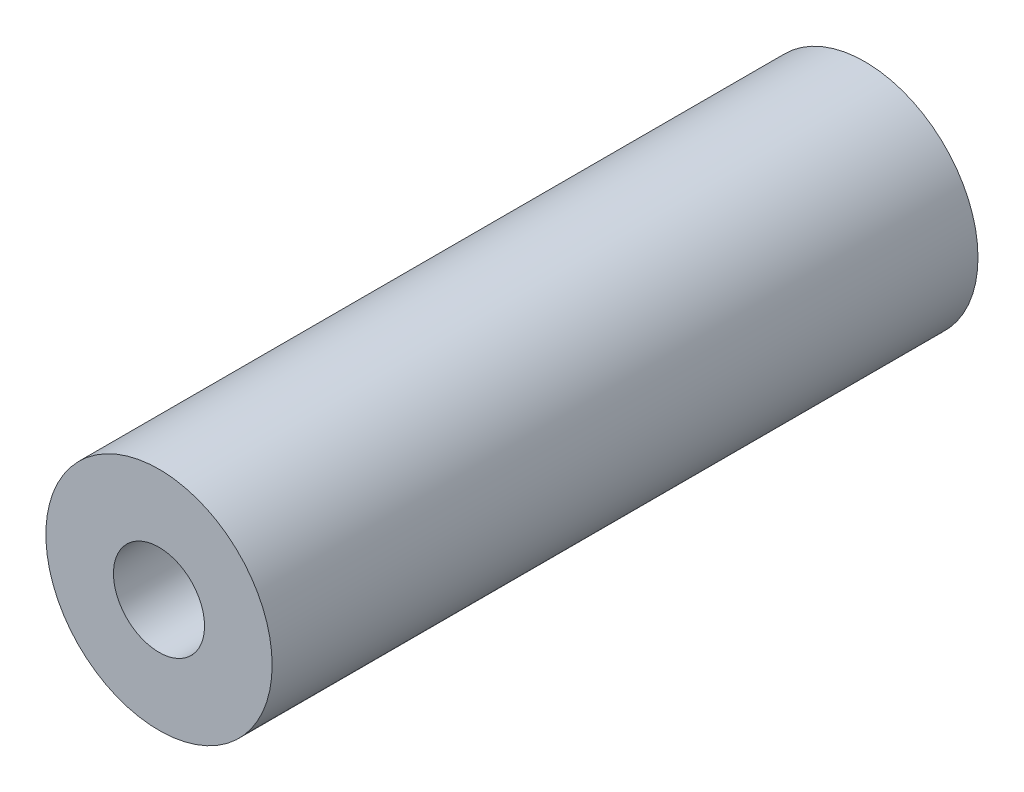
ISO-10303-21;
HEADER;
FILE_DESCRIPTION(('STEP AP214'),'2;1');
FILE_NAME('part.step','',(''),(''),'','','');
FILE_SCHEMA(('AUTOMOTIVE_DESIGN { 1 0 10303 214 1 1 1 1 }'));
ENDSEC;
DATA;
#1=APPLICATION_CONTEXT('core data for automotive mechanical design processes');
#2=APPLICATION_PROTOCOL_DEFINITION('international standard','automotive_design',2000,#1);
#3=PRODUCT_CONTEXT('',#1,'mechanical');
#4=PRODUCT('Part','Part','',(#3));
#5=PRODUCT_RELATED_PRODUCT_CATEGORY('part','',(#4));
#6=PRODUCT_DEFINITION_FORMATION('','',#4);
#7=PRODUCT_DEFINITION_CONTEXT('part definition',#1,'design');
#8=PRODUCT_DEFINITION('design','',#6,#7);
#9=PRODUCT_DEFINITION_SHAPE('','',#8);
#10=(LENGTH_UNIT() NAMED_UNIT(*) SI_UNIT(.MILLI.,.METRE.));
#11=(NAMED_UNIT(*) PLANE_ANGLE_UNIT() SI_UNIT($,.RADIAN.));
#12=(NAMED_UNIT(*) SI_UNIT($,.STERADIAN.) SOLID_ANGLE_UNIT());
#13=UNCERTAINTY_MEASURE_WITH_UNIT(LENGTH_MEASURE(1.E-05),#10,'distance_accuracy_value','');
#14=(GEOMETRIC_REPRESENTATION_CONTEXT(3) GLOBAL_UNCERTAINTY_ASSIGNED_CONTEXT((#13)) GLOBAL_UNIT_ASSIGNED_CONTEXT((#10,
#11,#12)) REPRESENTATION_CONTEXT('',''));
#15=CARTESIAN_POINT('',(0.,0.,0.));
#16=DIRECTION('',(0.,0.,1.));
#17=DIRECTION('',(1.,0.,0.));
#18=AXIS2_PLACEMENT_3D('',#15,#16,#17);
#19=CARTESIAN_POINT('',(0.,0.,196.85));
#20=DIRECTION('',(0.,0.,1.));
#21=DIRECTION('',(1.,0.,0.));
#22=AXIS2_PLACEMENT_3D('',#19,#20,#21);
#23=PLANE('',#22);
#24=CARTESIAN_POINT('',(0.,0.,196.85));
#25=DIRECTION('',(0.,0.,1.));
#26=DIRECTION('',(1.,0.,0.));
#27=AXIS2_PLACEMENT_3D('',#24,#25,#26);
#28=CIRCLE('',#27,31.55315);
#29=CARTESIAN_POINT('',(31.55315,0.,196.85));
#30=VERTEX_POINT('',#29);
#31=EDGE_CURVE('E10',#30,#30,#28,.T.);
#32=ORIENTED_EDGE('',*,*,#31,.T.);
#33=EDGE_LOOP('',(#32));
#34=FACE_BOUND('',#33,.T.);
#35=CARTESIAN_POINT('',(0.,0.,196.85));
#36=DIRECTION('',(0.,0.,1.));
#37=DIRECTION('',(1.,0.,0.));
#38=AXIS2_PLACEMENT_3D('',#35,#36,#37);
#39=CIRCLE('',#38,12.7);
#40=CARTESIAN_POINT('',(12.7,0.,196.85));
#41=VERTEX_POINT('',#40);
#42=EDGE_CURVE('E43',#41,#41,#39,.T.);
#43=ORIENTED_EDGE('',*,*,#42,.F.);
#44=EDGE_LOOP('',(#43));
#45=FACE_BOUND('',#44,.T.);
#46=ADVANCED_FACE('F32',(#34,#45),#23,.T.);
#47=CARTESIAN_POINT('',(0.,0.,0.));
#48=DIRECTION('',(0.,0.,1.));
#49=DIRECTION('',(1.,0.,0.));
#50=AXIS2_PLACEMENT_3D('',#47,#48,#49);
#51=PLANE('',#50);
#52=CARTESIAN_POINT('',(0.,0.,0.));
#53=DIRECTION('',(0.,0.,1.));
#54=DIRECTION('',(1.,0.,0.));
#55=AXIS2_PLACEMENT_3D('',#52,#53,#54);
#56=CIRCLE('',#55,31.55315);
#57=CARTESIAN_POINT('',(31.55315,0.,0.));
#58=VERTEX_POINT('',#57);
#59=EDGE_CURVE('E36',#58,#58,#56,.T.);
#60=ORIENTED_EDGE('',*,*,#59,.F.);
#61=EDGE_LOOP('',(#60));
#62=FACE_BOUND('',#61,.T.);
#63=CARTESIAN_POINT('',(0.,0.,0.));
#64=DIRECTION('',(0.,0.,1.));
#65=DIRECTION('',(1.,0.,0.));
#66=AXIS2_PLACEMENT_3D('',#63,#64,#65);
#67=CIRCLE('',#66,12.7);
#68=CARTESIAN_POINT('',(12.7,0.,0.));
#69=VERTEX_POINT('',#68);
#70=EDGE_CURVE('E45',#69,#69,#67,.T.);
#71=ORIENTED_EDGE('',*,*,#70,.T.);
#72=EDGE_LOOP('',(#71));
#73=FACE_BOUND('',#72,.T.);
#74=ADVANCED_FACE('F55',(#62,#73),#51,.F.);
#75=CARTESIAN_POINT('',(0.,0.,196.85));
#76=DIRECTION('',(0.,0.,-1.));
#77=DIRECTION('',(-1.,0.,0.));
#78=AXIS2_PLACEMENT_3D('',#75,#76,#77);
#79=CYLINDRICAL_SURFACE('',#78,31.55315);
#80=ORIENTED_EDGE('',*,*,#31,.F.);
#81=EDGE_LOOP('',(#80));
#82=FACE_BOUND('',#81,.T.);
#83=ORIENTED_EDGE('',*,*,#59,.T.);
#84=EDGE_LOOP('',(#83));
#85=FACE_BOUND('',#84,.T.);
#86=ADVANCED_FACE('F34',(#82,#85),#79,.T.);
#87=CARTESIAN_POINT('',(0.,0.,196.85));
#88=DIRECTION('',(0.,0.,-1.));
#89=DIRECTION('',(-1.,0.,0.));
#90=AXIS2_PLACEMENT_3D('',#87,#88,#89);
#91=CYLINDRICAL_SURFACE('',#90,12.7);
#92=ORIENTED_EDGE('',*,*,#42,.T.);
#93=EDGE_LOOP('',(#92));
#94=FACE_BOUND('',#93,.T.);
#95=ORIENTED_EDGE('',*,*,#70,.F.);
#96=EDGE_LOOP('',(#95));
#97=FACE_BOUND('',#96,.T.);
#98=ADVANCED_FACE('F51',(#94,#97),#91,.F.);
#99=CLOSED_SHELL('',(#46,#74,#86,#98));
#100=MANIFOLD_SOLID_BREP('B2',#99);
#101=ADVANCED_BREP_SHAPE_REPRESENTATION('',(#18,#100),#14);
#102=SHAPE_DEFINITION_REPRESENTATION(#9,#101);
ENDSEC;
END-ISO-10303-21;
